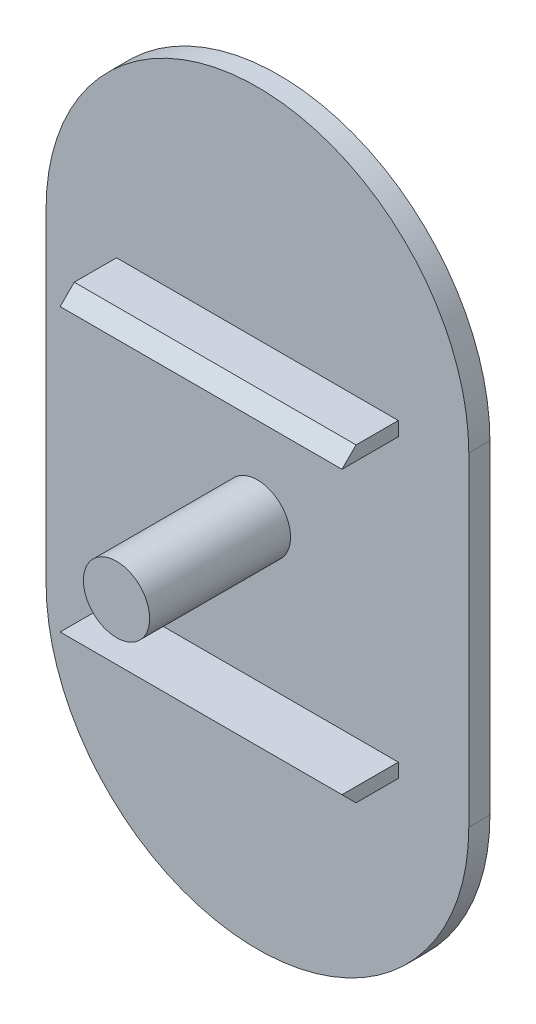
ISO-10303-21;
HEADER;
FILE_DESCRIPTION(('STEP AP214'),'2;1');
FILE_NAME('part.step','',(''),(''),'','','');
FILE_SCHEMA(('AUTOMOTIVE_DESIGN { 1 0 10303 214 1 1 1 1 }'));
ENDSEC;
DATA;
#1=APPLICATION_CONTEXT('core data for automotive mechanical design processes');
#2=APPLICATION_PROTOCOL_DEFINITION('international standard','automotive_design',2000,#1);
#3=PRODUCT_CONTEXT('',#1,'mechanical');
#4=PRODUCT('Part','Part','',(#3));
#5=PRODUCT_RELATED_PRODUCT_CATEGORY('part','',(#4));
#6=PRODUCT_DEFINITION_FORMATION('','',#4);
#7=PRODUCT_DEFINITION_CONTEXT('part definition',#1,'design');
#8=PRODUCT_DEFINITION('design','',#6,#7);
#9=PRODUCT_DEFINITION_SHAPE('','',#8);
#10=(LENGTH_UNIT() NAMED_UNIT(*) SI_UNIT(.MILLI.,.METRE.));
#11=(NAMED_UNIT(*) PLANE_ANGLE_UNIT() SI_UNIT($,.RADIAN.));
#12=(NAMED_UNIT(*) SI_UNIT($,.STERADIAN.) SOLID_ANGLE_UNIT());
#13=UNCERTAINTY_MEASURE_WITH_UNIT(LENGTH_MEASURE(1.E-05),#10,'distance_accuracy_value','');
#14=(GEOMETRIC_REPRESENTATION_CONTEXT(3) GLOBAL_UNCERTAINTY_ASSIGNED_CONTEXT((#13)) GLOBAL_UNIT_ASSIGNED_CONTEXT((#10,
#11,#12)) REPRESENTATION_CONTEXT('',''));
#15=CARTESIAN_POINT('',(0.,0.,0.));
#16=DIRECTION('',(0.,0.,1.));
#17=DIRECTION('',(1.,0.,0.));
#18=AXIS2_PLACEMENT_3D('',#15,#16,#17);
#19=CARTESIAN_POINT('',(0.,11.5,1.5));
#20=DIRECTION('',(0.,0.,-1.));
#21=DIRECTION('',(-1.,0.,0.));
#22=AXIS2_PLACEMENT_3D('',#19,#20,#21);
#23=PLANE('',#22);
#24=DIRECTION('',(0.,1.,0.));
#25=VECTOR('',#24,1.);
#26=CARTESIAN_POINT('',(10.,-11.,1.5));
#27=LINE('',#26,#25);
#28=CARTESIAN_POINT('',(10.,-11.,1.5));
#29=VERTEX_POINT('',#28);
#30=CARTESIAN_POINT('',(10.,-10.,1.5));
#31=VERTEX_POINT('',#30);
#32=EDGE_CURVE('E148',#29,#31,#27,.T.);
#33=ORIENTED_EDGE('',*,*,#32,.F.);
#34=DIRECTION('',(1.,0.,0.));
#35=VECTOR('',#34,1.);
#36=CARTESIAN_POINT('',(-10.,-11.,1.5));
#37=LINE('',#36,#35);
#38=CARTESIAN_POINT('',(-10.,-11.,1.5));
#39=VERTEX_POINT('',#38);
#40=EDGE_CURVE('E178',#39,#29,#37,.T.);
#41=ORIENTED_EDGE('',*,*,#40,.F.);
#42=DIRECTION('',(0.,-1.,0.));
#43=VECTOR('',#42,1.);
#44=CARTESIAN_POINT('',(-10.,-10.,1.5));
#45=LINE('',#44,#43);
#46=CARTESIAN_POINT('',(-10.,-10.,1.5));
#47=VERTEX_POINT('',#46);
#48=EDGE_CURVE('E186',#47,#39,#45,.T.);
#49=ORIENTED_EDGE('',*,*,#48,.F.);
#50=DIRECTION('',(-1.,0.,0.));
#51=VECTOR('',#50,1.);
#52=CARTESIAN_POINT('',(-10.,-10.,1.5));
#53=LINE('',#52,#51);
#54=EDGE_CURVE('E182',#31,#47,#53,.T.);
#55=ORIENTED_EDGE('',*,*,#54,.F.);
#56=EDGE_LOOP('',(#33,#41,#49,#55));
#57=FACE_BOUND('',#56,.T.);
#58=CARTESIAN_POINT('',(0.,0.,1.5));
#59=DIRECTION('',(0.,0.,-1.));
#60=DIRECTION('',(-1.,0.,0.));
#61=AXIS2_PLACEMENT_3D('',#58,#59,#60);
#62=CIRCLE('',#61,2.35);
#63=CARTESIAN_POINT('',(-2.35,0.,1.5));
#64=VERTEX_POINT('',#63);
#65=EDGE_CURVE('E284',#64,#64,#62,.F.);
#66=ORIENTED_EDGE('',*,*,#65,.F.);
#67=EDGE_LOOP('',(#66));
#68=FACE_BOUND('',#67,.T.);
#69=CARTESIAN_POINT('',(0.,11.5,1.5));
#70=DIRECTION('',(0.,0.,1.));
#71=DIRECTION('',(-1.,0.,0.));
#72=AXIS2_PLACEMENT_3D('',#69,#70,#71);
#73=CIRCLE('',#72,15.);
#74=CARTESIAN_POINT('',(15.,11.5,1.5));
#75=VERTEX_POINT('',#74);
#76=CARTESIAN_POINT('',(-15.,11.5,1.5));
#77=VERTEX_POINT('',#76);
#78=EDGE_CURVE('E235',#75,#77,#73,.T.);
#79=ORIENTED_EDGE('',*,*,#78,.T.);
#80=DIRECTION('',(0.,-1.,0.));
#81=VECTOR('',#80,1.);
#82=CARTESIAN_POINT('',(-15.,-11.5,1.5));
#83=LINE('',#82,#81);
#84=CARTESIAN_POINT('',(-15.,-11.5,1.5));
#85=VERTEX_POINT('',#84);
#86=EDGE_CURVE('E239',#77,#85,#83,.T.);
#87=ORIENTED_EDGE('',*,*,#86,.T.);
#88=CARTESIAN_POINT('',(0.,-11.5,1.5));
#89=DIRECTION('',(0.,0.,1.));
#90=DIRECTION('',(1.,0.,0.));
#91=AXIS2_PLACEMENT_3D('',#88,#89,#90);
#92=CIRCLE('',#91,15.);
#93=CARTESIAN_POINT('',(15.,-11.5,1.5));
#94=VERTEX_POINT('',#93);
#95=EDGE_CURVE('E243',#85,#94,#92,.T.);
#96=ORIENTED_EDGE('',*,*,#95,.T.);
#97=DIRECTION('',(0.,1.,0.));
#98=VECTOR('',#97,1.);
#99=CARTESIAN_POINT('',(15.,11.5,1.5));
#100=LINE('',#99,#98);
#101=EDGE_CURVE('E246',#94,#75,#100,.T.);
#102=ORIENTED_EDGE('',*,*,#101,.T.);
#103=EDGE_LOOP('',(#79,#87,#96,#102));
#104=FACE_BOUND('',#103,.T.);
#105=DIRECTION('',(1.,0.,0.));
#106=VECTOR('',#105,1.);
#107=CARTESIAN_POINT('',(-10.,10.,1.5));
#108=LINE('',#107,#106);
#109=CARTESIAN_POINT('',(-10.,10.,1.5));
#110=VERTEX_POINT('',#109);
#111=CARTESIAN_POINT('',(10.,10.,1.5));
#112=VERTEX_POINT('',#111);
#113=EDGE_CURVE('E136',#110,#112,#108,.T.);
#114=ORIENTED_EDGE('',*,*,#113,.F.);
#115=DIRECTION('',(0.,-1.,0.));
#116=VECTOR('',#115,1.);
#117=CARTESIAN_POINT('',(-10.,10.,1.5));
#118=LINE('',#117,#116);
#119=CARTESIAN_POINT('',(-10.,11.,1.5));
#120=VERTEX_POINT('',#119);
#121=EDGE_CURVE('E139',#120,#110,#118,.T.);
#122=ORIENTED_EDGE('',*,*,#121,.F.);
#123=DIRECTION('',(-1.,0.,0.));
#124=VECTOR('',#123,1.);
#125=CARTESIAN_POINT('',(-10.,11.,1.5));
#126=LINE('',#125,#124);
#127=CARTESIAN_POINT('',(10.,11.,1.5));
#128=VERTEX_POINT('',#127);
#129=EDGE_CURVE('E155',#128,#120,#126,.T.);
#130=ORIENTED_EDGE('',*,*,#129,.F.);
#131=DIRECTION('',(0.,1.,0.));
#132=VECTOR('',#131,1.);
#133=CARTESIAN_POINT('',(10.,11.,1.5));
#134=LINE('',#133,#132);
#135=EDGE_CURVE('E142',#112,#128,#134,.T.);
#136=ORIENTED_EDGE('',*,*,#135,.F.);
#137=EDGE_LOOP('',(#114,#122,#130,#136));
#138=FACE_BOUND('',#137,.T.);
#139=ADVANCED_FACE('F47',(#57,#68,#104,#138),#23,.F.);
#140=CARTESIAN_POINT('',(0.,11.5,1.5));
#141=DIRECTION('',(0.,0.,-1.));
#142=DIRECTION('',(-1.,0.,0.));
#143=AXIS2_PLACEMENT_3D('',#140,#141,#142);
#144=CYLINDRICAL_SURFACE('',#143,15.);
#145=CARTESIAN_POINT('',(0.,11.5,0.));
#146=DIRECTION('',(0.,0.,1.));
#147=DIRECTION('',(-1.,0.,0.));
#148=AXIS2_PLACEMENT_3D('',#145,#146,#147);
#149=CIRCLE('',#148,15.);
#150=CARTESIAN_POINT('',(15.,11.5,0.));
#151=VERTEX_POINT('',#150);
#152=CARTESIAN_POINT('',(-15.,11.5,0.));
#153=VERTEX_POINT('',#152);
#154=EDGE_CURVE('E231',#151,#153,#149,.T.);
#155=ORIENTED_EDGE('',*,*,#154,.T.);
#156=DIRECTION('',(0.,0.,-1.));
#157=VECTOR('',#156,1.);
#158=CARTESIAN_POINT('',(-15.,11.5,1.5));
#159=LINE('',#158,#157);
#160=EDGE_CURVE('E272',#77,#153,#159,.T.);
#161=ORIENTED_EDGE('',*,*,#160,.F.);
#162=ORIENTED_EDGE('',*,*,#78,.F.);
#163=DIRECTION('',(0.,0.,-1.));
#164=VECTOR('',#163,1.);
#165=CARTESIAN_POINT('',(15.,11.5,1.5));
#166=LINE('',#165,#164);
#167=EDGE_CURVE('E249',#75,#151,#166,.T.);
#168=ORIENTED_EDGE('',*,*,#167,.T.);
#169=EDGE_LOOP('',(#155,#161,#162,#168));
#170=FACE_BOUND('',#169,.T.);
#171=ADVANCED_FACE('F321',(#170),#144,.T.);
#172=CARTESIAN_POINT('',(-15.,-11.5,1.5));
#173=DIRECTION('',(1.,0.,0.));
#174=DIRECTION('',(0.,0.,-1.));
#175=AXIS2_PLACEMENT_3D('',#172,#173,#174);
#176=PLANE('',#175);
#177=DIRECTION('',(0.,-1.,0.));
#178=VECTOR('',#177,1.);
#179=CARTESIAN_POINT('',(-15.,-11.5,0.));
#180=LINE('',#179,#178);
#181=CARTESIAN_POINT('',(-15.,-11.5,0.));
#182=VERTEX_POINT('',#181);
#183=EDGE_CURVE('E253',#153,#182,#180,.T.);
#184=ORIENTED_EDGE('',*,*,#183,.T.);
#185=DIRECTION('',(0.,0.,-1.));
#186=VECTOR('',#185,1.);
#187=CARTESIAN_POINT('',(-15.,-11.5,1.5));
#188=LINE('',#187,#186);
#189=EDGE_CURVE('E268',#85,#182,#188,.T.);
#190=ORIENTED_EDGE('',*,*,#189,.F.);
#191=ORIENTED_EDGE('',*,*,#86,.F.);
#192=ORIENTED_EDGE('',*,*,#160,.T.);
#193=EDGE_LOOP('',(#184,#190,#191,#192));
#194=FACE_BOUND('',#193,.T.);
#195=ADVANCED_FACE('F333',(#194),#176,.F.);
#196=CARTESIAN_POINT('',(0.,-11.5,1.5));
#197=DIRECTION('',(0.,0.,-1.));
#198=DIRECTION('',(-1.,0.,0.));
#199=AXIS2_PLACEMENT_3D('',#196,#197,#198);
#200=CYLINDRICAL_SURFACE('',#199,15.);
#201=CARTESIAN_POINT('',(0.,-11.5,0.));
#202=DIRECTION('',(0.,0.,1.));
#203=DIRECTION('',(1.,0.,0.));
#204=AXIS2_PLACEMENT_3D('',#201,#202,#203);
#205=CIRCLE('',#204,15.);
#206=CARTESIAN_POINT('',(15.,-11.5,0.));
#207=VERTEX_POINT('',#206);
#208=EDGE_CURVE('E256',#182,#207,#205,.T.);
#209=ORIENTED_EDGE('',*,*,#208,.T.);
#210=DIRECTION('',(0.,0.,-1.));
#211=VECTOR('',#210,1.);
#212=CARTESIAN_POINT('',(15.,-11.5,1.5));
#213=LINE('',#212,#211);
#214=EDGE_CURVE('E264',#94,#207,#213,.T.);
#215=ORIENTED_EDGE('',*,*,#214,.F.);
#216=ORIENTED_EDGE('',*,*,#95,.F.);
#217=ORIENTED_EDGE('',*,*,#189,.T.);
#218=EDGE_LOOP('',(#209,#215,#216,#217));
#219=FACE_BOUND('',#218,.T.);
#220=ADVANCED_FACE('F338',(#219),#200,.T.);
#221=CARTESIAN_POINT('',(15.,11.5,1.5));
#222=DIRECTION('',(-1.,0.,0.));
#223=DIRECTION('',(0.,0.,1.));
#224=AXIS2_PLACEMENT_3D('',#221,#222,#223);
#225=PLANE('',#224);
#226=DIRECTION('',(0.,1.,0.));
#227=VECTOR('',#226,1.);
#228=CARTESIAN_POINT('',(15.,11.5,0.));
#229=LINE('',#228,#227);
#230=EDGE_CURVE('E240',#207,#151,#229,.T.);
#231=ORIENTED_EDGE('',*,*,#230,.T.);
#232=ORIENTED_EDGE('',*,*,#167,.F.);
#233=ORIENTED_EDGE('',*,*,#101,.F.);
#234=ORIENTED_EDGE('',*,*,#214,.T.);
#235=EDGE_LOOP('',(#231,#232,#233,#234));
#236=FACE_BOUND('',#235,.T.);
#237=ADVANCED_FACE('F341',(#236),#225,.F.);
#238=CARTESIAN_POINT('',(0.,11.5,0.));
#239=DIRECTION('',(0.,0.,-1.));
#240=DIRECTION('',(-1.,0.,0.));
#241=AXIS2_PLACEMENT_3D('',#238,#239,#240);
#242=PLANE('',#241);
#243=CARTESIAN_POINT('',(-3.47592832449396E-13,-12.5,0.));
#244=DIRECTION('',(0.,0.,-1.));
#245=DIRECTION('',(-1.,0.,0.));
#246=AXIS2_PLACEMENT_3D('',#243,#244,#245);
#247=CIRCLE('',#246,1.85);
#248=CARTESIAN_POINT('',(-1.85000000000035,-12.5,0.));
#249=VERTEX_POINT('',#248);
#250=EDGE_CURVE('E219',#249,#249,#247,.T.);
#251=ORIENTED_EDGE('',*,*,#250,.F.);
#252=EDGE_LOOP('',(#251));
#253=FACE_BOUND('',#252,.T.);
#254=CARTESIAN_POINT('',(0.,12.5,0.));
#255=DIRECTION('',(0.,0.,-1.));
#256=DIRECTION('',(-1.,0.,0.));
#257=AXIS2_PLACEMENT_3D('',#254,#255,#256);
#258=CIRCLE('',#257,1.85);
#259=CARTESIAN_POINT('',(-1.85,12.5,0.));
#260=VERTEX_POINT('',#259);
#261=EDGE_CURVE('E223',#260,#260,#258,.T.);
#262=ORIENTED_EDGE('',*,*,#261,.F.);
#263=EDGE_LOOP('',(#262));
#264=FACE_BOUND('',#263,.T.);
#265=ORIENTED_EDGE('',*,*,#154,.F.);
#266=ORIENTED_EDGE('',*,*,#230,.F.);
#267=ORIENTED_EDGE('',*,*,#208,.F.);
#268=ORIENTED_EDGE('',*,*,#183,.F.);
#269=EDGE_LOOP('',(#265,#266,#267,#268));
#270=FACE_BOUND('',#269,.T.);
#271=ADVANCED_FACE('F343',(#253,#264,#270),#242,.T.);
#272=CARTESIAN_POINT('',(0.,12.5,-1.5));
#273=DIRECTION('',(0.,0.,1.));
#274=DIRECTION('',(1.,0.,0.));
#275=AXIS2_PLACEMENT_3D('',#272,#273,#274);
#276=CYLINDRICAL_SURFACE('',#275,1.85);
#277=CARTESIAN_POINT('',(0.,12.5,-1.5));
#278=DIRECTION('',(0.,0.,-1.));
#279=DIRECTION('',(-1.,0.,0.));
#280=AXIS2_PLACEMENT_3D('',#277,#278,#279);
#281=CIRCLE('',#280,1.85);
#282=CARTESIAN_POINT('',(-1.85,12.5,-1.5));
#283=VERTEX_POINT('',#282);
#284=EDGE_CURVE('E227',#283,#283,#281,.T.);
#285=ORIENTED_EDGE('',*,*,#284,.F.);
#286=EDGE_LOOP('',(#285));
#287=FACE_BOUND('',#286,.T.);
#288=ORIENTED_EDGE('',*,*,#261,.T.);
#289=EDGE_LOOP('',(#288));
#290=FACE_BOUND('',#289,.T.);
#291=ADVANCED_FACE('F345',(#287,#290),#276,.T.);
#292=CARTESIAN_POINT('',(-3.47592832449396E-13,-12.5,-1.5));
#293=DIRECTION('',(0.,0.,1.));
#294=DIRECTION('',(1.,0.,0.));
#295=AXIS2_PLACEMENT_3D('',#292,#293,#294);
#296=CYLINDRICAL_SURFACE('',#295,1.85);
#297=CARTESIAN_POINT('',(-3.47592832449396E-13,-12.5,-1.5));
#298=DIRECTION('',(0.,0.,-1.));
#299=DIRECTION('',(-1.,0.,0.));
#300=AXIS2_PLACEMENT_3D('',#297,#298,#299);
#301=CIRCLE('',#300,1.85);
#302=CARTESIAN_POINT('',(-1.85000000000035,-12.5,-1.5));
#303=VERTEX_POINT('',#302);
#304=EDGE_CURVE('E218',#303,#303,#301,.T.);
#305=ORIENTED_EDGE('',*,*,#304,.F.);
#306=EDGE_LOOP('',(#305));
#307=FACE_BOUND('',#306,.T.);
#308=ORIENTED_EDGE('',*,*,#250,.T.);
#309=EDGE_LOOP('',(#308));
#310=FACE_BOUND('',#309,.T.);
#311=ADVANCED_FACE('F352',(#307,#310),#296,.T.);
#312=CARTESIAN_POINT('',(0.,12.5,-3.2));
#313=DIRECTION('',(0.,0.,-1.));
#314=DIRECTION('',(-1.,0.,0.));
#315=AXIS2_PLACEMENT_3D('',#312,#313,#314);
#316=PLANE('',#315);
#317=CARTESIAN_POINT('',(0.,12.5,-3.2));
#318=DIRECTION('',(0.,0.,-1.));
#319=DIRECTION('',(-1.,0.,0.));
#320=AXIS2_PLACEMENT_3D('',#317,#318,#319);
#321=CIRCLE('',#320,1.87262800667148);
#322=CARTESIAN_POINT('',(-1.87262800667148,12.5,-3.2));
#323=VERTEX_POINT('',#322);
#324=EDGE_CURVE('E280',#323,#323,#321,.T.);
#325=ORIENTED_EDGE('',*,*,#324,.T.);
#326=EDGE_LOOP('',(#325));
#327=FACE_BOUND('',#326,.T.);
#328=ADVANCED_FACE('F415',(#327),#316,.T.);
#329=CARTESIAN_POINT('',(0.,12.5,-1.5));
#330=DIRECTION('',(0.,0.,-1.));
#331=DIRECTION('',(-1.,0.,0.));
#332=AXIS2_PLACEMENT_3D('',#329,#330,#331);
#333=PLANE('',#332);
#334=ORIENTED_EDGE('',*,*,#284,.T.);
#335=EDGE_LOOP('',(#334));
#336=FACE_BOUND('',#335,.T.);
#337=CARTESIAN_POINT('',(0.,12.5,-1.5));
#338=DIRECTION('',(0.,0.,-1.));
#339=DIRECTION('',(-1.,0.,0.));
#340=AXIS2_PLACEMENT_3D('',#337,#338,#339);
#341=CIRCLE('',#340,3.85);
#342=CARTESIAN_POINT('',(-3.85,12.5,-1.5));
#343=VERTEX_POINT('',#342);
#344=EDGE_CURVE('E214',#343,#343,#341,.T.);
#345=ORIENTED_EDGE('',*,*,#344,.F.);
#346=EDGE_LOOP('',(#345));
#347=FACE_BOUND('',#346,.T.);
#348=ADVANCED_FACE('F413',(#336,#347),#333,.F.);
#349=CARTESIAN_POINT('',(-3.47592832449396E-13,-12.5,-3.2));
#350=DIRECTION('',(0.,0.,-1.));
#351=DIRECTION('',(-1.,0.,0.));
#352=AXIS2_PLACEMENT_3D('',#349,#350,#351);
#353=PLANE('',#352);
#354=CARTESIAN_POINT('',(-3.47592832449396E-13,-12.5,-3.2));
#355=DIRECTION('',(0.,0.,-1.));
#356=DIRECTION('',(-1.,0.,0.));
#357=AXIS2_PLACEMENT_3D('',#354,#355,#356);
#358=CIRCLE('',#357,1.87262800667148);
#359=CARTESIAN_POINT('',(-1.87262800667183,-12.5,-3.2));
#360=VERTEX_POINT('',#359);
#361=EDGE_CURVE('E276',#360,#360,#358,.T.);
#362=ORIENTED_EDGE('',*,*,#361,.T.);
#363=EDGE_LOOP('',(#362));
#364=FACE_BOUND('',#363,.T.);
#365=ADVANCED_FACE('F409',(#364),#353,.T.);
#366=CARTESIAN_POINT('',(-3.47592832449396E-13,-12.5,-1.5));
#367=DIRECTION('',(0.,0.,-1.));
#368=DIRECTION('',(-1.,0.,0.));
#369=AXIS2_PLACEMENT_3D('',#366,#367,#368);
#370=PLANE('',#369);
#371=ORIENTED_EDGE('',*,*,#304,.T.);
#372=EDGE_LOOP('',(#371));
#373=FACE_BOUND('',#372,.T.);
#374=CARTESIAN_POINT('',(-3.47592832449396E-13,-12.5,-1.5));
#375=DIRECTION('',(0.,0.,-1.));
#376=DIRECTION('',(-1.,0.,0.));
#377=AXIS2_PLACEMENT_3D('',#374,#375,#376);
#378=CIRCLE('',#377,3.85);
#379=CARTESIAN_POINT('',(-3.85000000000035,-12.5,-1.5));
#380=VERTEX_POINT('',#379);
#381=EDGE_CURVE('E210',#380,#380,#378,.T.);
#382=ORIENTED_EDGE('',*,*,#381,.F.);
#383=EDGE_LOOP('',(#382));
#384=FACE_BOUND('',#383,.T.);
#385=ADVANCED_FACE('F369',(#373,#384),#370,.F.);
#386=CARTESIAN_POINT('',(-3.47592832449396E-13,-12.5,-1.2));
#387=DIRECTION('',(0.,0.,1.));
#388=DIRECTION('',(1.,0.,0.));
#389=AXIS2_PLACEMENT_3D('',#386,#387,#388);
#390=DEGENERATE_TOROIDAL_SURFACE('',#389,1.87262800667148,2.,.T.);
#391=ORIENTED_EDGE('',*,*,#381,.T.);
#392=EDGE_LOOP('',(#391));
#393=FACE_BOUND('',#392,.T.);
#394=ORIENTED_EDGE('',*,*,#361,.F.);
#395=EDGE_LOOP('',(#394));
#396=FACE_BOUND('',#395,.T.);
#397=ADVANCED_FACE('F365',(#393,#396),#390,.T.);
#398=CARTESIAN_POINT('',(0.,12.5,-1.2));
#399=DIRECTION('',(0.,0.,1.));
#400=DIRECTION('',(1.,0.,0.));
#401=AXIS2_PLACEMENT_3D('',#398,#399,#400);
#402=DEGENERATE_TOROIDAL_SURFACE('',#401,1.87262800667148,2.,.T.);
#403=ORIENTED_EDGE('',*,*,#344,.T.);
#404=EDGE_LOOP('',(#403));
#405=FACE_BOUND('',#404,.T.);
#406=ORIENTED_EDGE('',*,*,#324,.F.);
#407=EDGE_LOOP('',(#406));
#408=FACE_BOUND('',#407,.T.);
#409=ADVANCED_FACE('F368',(#405,#408),#402,.T.);
#410=CARTESIAN_POINT('',(0.,0.,11.5));
#411=DIRECTION('',(0.,0.,-1.));
#412=DIRECTION('',(-1.,0.,0.));
#413=AXIS2_PLACEMENT_3D('',#410,#411,#412);
#414=CYLINDRICAL_SURFACE('',#413,2.35);
#415=CARTESIAN_POINT('',(0.,0.,11.5));
#416=DIRECTION('',(0.,0.,1.));
#417=DIRECTION('',(1.,0.,0.));
#418=AXIS2_PLACEMENT_3D('',#415,#416,#417);
#419=CIRCLE('',#418,2.35);
#420=CARTESIAN_POINT('',(2.35,0.,11.5));
#421=VERTEX_POINT('',#420);
#422=EDGE_CURVE('E206',#421,#421,#419,.T.);
#423=ORIENTED_EDGE('',*,*,#422,.F.);
#424=EDGE_LOOP('',(#423));
#425=FACE_BOUND('',#424,.T.);
#426=ORIENTED_EDGE('',*,*,#65,.T.);
#427=EDGE_LOOP('',(#426));
#428=FACE_BOUND('',#427,.T.);
#429=ADVANCED_FACE('F372',(#425,#428),#414,.T.);
#430=CARTESIAN_POINT('',(0.,0.,11.5));
#431=DIRECTION('',(0.,0.,1.));
#432=DIRECTION('',(1.,0.,0.));
#433=AXIS2_PLACEMENT_3D('',#430,#431,#432);
#434=PLANE('',#433);
#435=ORIENTED_EDGE('',*,*,#422,.T.);
#436=EDGE_LOOP('',(#435));
#437=FACE_BOUND('',#436,.T.);
#438=ADVANCED_FACE('F400',(#437),#434,.T.);
#439=CARTESIAN_POINT('',(10.,-11.,5.5));
#440=DIRECTION('',(-1.,0.,0.));
#441=DIRECTION('',(0.,0.,1.));
#442=AXIS2_PLACEMENT_3D('',#439,#440,#441);
#443=PLANE('',#442);
#444=DIRECTION('',(0.,0.,-1.));
#445=VECTOR('',#444,1.);
#446=CARTESIAN_POINT('',(10.,-10.,5.5));
#447=LINE('',#446,#445);
#448=CARTESIAN_POINT('',(10.,-10.,5.5));
#449=VERTEX_POINT('',#448);
#450=EDGE_CURVE('E202',#449,#31,#447,.T.);
#451=ORIENTED_EDGE('',*,*,#450,.F.);
#452=DIRECTION('',(0.,0.707106781186545,0.70710678118655));
#453=VECTOR('',#452,1.);
#454=CARTESIAN_POINT('',(10.,-10.,5.5));
#455=LINE('',#454,#453);
#456=CARTESIAN_POINT('',(10.,-11.,4.49999999999999));
#457=VERTEX_POINT('',#456);
#458=EDGE_CURVE('E288',#449,#457,#455,.F.);
#459=ORIENTED_EDGE('',*,*,#458,.T.);
#460=DIRECTION('',(0.,0.,-1.));
#461=VECTOR('',#460,1.);
#462=CARTESIAN_POINT('',(10.,-11.,5.5));
#463=LINE('',#462,#461);
#464=EDGE_CURVE('E177',#457,#29,#463,.T.);
#465=ORIENTED_EDGE('',*,*,#464,.T.);
#466=ORIENTED_EDGE('',*,*,#32,.T.);
#467=EDGE_LOOP('',(#451,#459,#465,#466));
#468=FACE_BOUND('',#467,.T.);
#469=ADVANCED_FACE('F313',(#468),#443,.F.);
#470=CARTESIAN_POINT('',(-10.,-10.,5.5));
#471=DIRECTION('',(0.,-1.,0.));
#472=DIRECTION('',(0.,0.,-1.));
#473=AXIS2_PLACEMENT_3D('',#470,#471,#472);
#474=PLANE('',#473);
#475=ORIENTED_EDGE('',*,*,#54,.T.);
#476=DIRECTION('',(0.,0.,-1.));
#477=VECTOR('',#476,1.);
#478=CARTESIAN_POINT('',(-10.,-10.,5.5));
#479=LINE('',#478,#477);
#480=CARTESIAN_POINT('',(-10.,-10.,5.5));
#481=VERTEX_POINT('',#480);
#482=EDGE_CURVE('E198',#481,#47,#479,.T.);
#483=ORIENTED_EDGE('',*,*,#482,.F.);
#484=DIRECTION('',(-1.,0.,0.));
#485=VECTOR('',#484,1.);
#486=CARTESIAN_POINT('',(-10.,-10.,5.5));
#487=LINE('',#486,#485);
#488=EDGE_CURVE('E173',#449,#481,#487,.T.);
#489=ORIENTED_EDGE('',*,*,#488,.F.);
#490=ORIENTED_EDGE('',*,*,#450,.T.);
#491=EDGE_LOOP('',(#475,#483,#489,#490));
#492=FACE_BOUND('',#491,.T.);
#493=ADVANCED_FACE('F308',(#492),#474,.F.);
#494=CARTESIAN_POINT('',(-10.,-10.,5.5));
#495=DIRECTION('',(1.,0.,0.));
#496=DIRECTION('',(0.,0.,-1.));
#497=AXIS2_PLACEMENT_3D('',#494,#495,#496);
#498=PLANE('',#497);
#499=DIRECTION('',(0.,0.,-1.));
#500=VECTOR('',#499,1.);
#501=CARTESIAN_POINT('',(-10.,-11.,5.5));
#502=LINE('',#501,#500);
#503=CARTESIAN_POINT('',(-10.,-11.,4.49999999999999));
#504=VERTEX_POINT('',#503);
#505=EDGE_CURVE('E195',#504,#39,#502,.T.);
#506=ORIENTED_EDGE('',*,*,#505,.F.);
#507=DIRECTION('',(0.,-0.707106781186545,-0.70710678118655));
#508=VECTOR('',#507,1.);
#509=CARTESIAN_POINT('',(-10.,-10.,5.5));
#510=LINE('',#509,#508);
#511=EDGE_CURVE('E294',#504,#481,#510,.F.);
#512=ORIENTED_EDGE('',*,*,#511,.T.);
#513=ORIENTED_EDGE('',*,*,#482,.T.);
#514=ORIENTED_EDGE('',*,*,#48,.T.);
#515=EDGE_LOOP('',(#506,#512,#513,#514));
#516=FACE_BOUND('',#515,.T.);
#517=ADVANCED_FACE('F303',(#516),#498,.F.);
#518=CARTESIAN_POINT('',(-10.,-11.,5.5));
#519=DIRECTION('',(0.,1.,0.));
#520=DIRECTION('',(0.,0.,1.));
#521=AXIS2_PLACEMENT_3D('',#518,#519,#520);
#522=PLANE('',#521);
#523=ORIENTED_EDGE('',*,*,#464,.F.);
#524=DIRECTION('',(-1.,0.,0.));
#525=VECTOR('',#524,1.);
#526=CARTESIAN_POINT('',(-10.,-11.,4.49999999999999));
#527=LINE('',#526,#525);
#528=EDGE_CURVE('E291',#457,#504,#527,.T.);
#529=ORIENTED_EDGE('',*,*,#528,.T.);
#530=ORIENTED_EDGE('',*,*,#505,.T.);
#531=ORIENTED_EDGE('',*,*,#40,.T.);
#532=EDGE_LOOP('',(#523,#529,#530,#531));
#533=FACE_BOUND('',#532,.T.);
#534=ADVANCED_FACE('F316',(#533),#522,.F.);
#535=CARTESIAN_POINT('',(-10.,10.,5.5));
#536=DIRECTION('',(0.,1.,0.));
#537=DIRECTION('',(0.,0.,1.));
#538=AXIS2_PLACEMENT_3D('',#535,#536,#537);
#539=PLANE('',#538);
#540=ORIENTED_EDGE('',*,*,#113,.T.);
#541=DIRECTION('',(0.,0.,-1.));
#542=VECTOR('',#541,1.);
#543=CARTESIAN_POINT('',(10.,10.,5.5));
#544=LINE('',#543,#542);
#545=CARTESIAN_POINT('',(10.,10.,5.5));
#546=VERTEX_POINT('',#545);
#547=EDGE_CURVE('E586',#546,#112,#544,.T.);
#548=ORIENTED_EDGE('',*,*,#547,.F.);
#549=DIRECTION('',(1.,0.,0.));
#550=VECTOR('',#549,1.);
#551=CARTESIAN_POINT('',(-10.,10.,5.5));
#552=LINE('',#551,#550);
#553=CARTESIAN_POINT('',(-10.,10.,5.5));
#554=VERTEX_POINT('',#553);
#555=EDGE_CURVE('E156',#554,#546,#552,.T.);
#556=ORIENTED_EDGE('',*,*,#555,.F.);
#557=DIRECTION('',(0.,0.,-1.));
#558=VECTOR('',#557,1.);
#559=CARTESIAN_POINT('',(-10.,10.,5.5));
#560=LINE('',#559,#558);
#561=EDGE_CURVE('E151',#554,#110,#560,.T.);
#562=ORIENTED_EDGE('',*,*,#561,.T.);
#563=EDGE_LOOP('',(#540,#548,#556,#562));
#564=FACE_BOUND('',#563,.T.);
#565=ADVANCED_FACE('F158',(#564),#539,.F.);
#566=CARTESIAN_POINT('',(10.,11.,5.5));
#567=DIRECTION('',(-1.,0.,0.));
#568=DIRECTION('',(0.,-1.,0.));
#569=AXIS2_PLACEMENT_3D('',#566,#567,#568);
#570=PLANE('',#569);
#571=DIRECTION('',(0.,0.,-1.));
#572=VECTOR('',#571,1.);
#573=CARTESIAN_POINT('',(10.,11.,5.5));
#574=LINE('',#573,#572);
#575=CARTESIAN_POINT('',(10.,11.,4.49999999999999));
#576=VERTEX_POINT('',#575);
#577=EDGE_CURVE('E165',#576,#128,#574,.T.);
#578=ORIENTED_EDGE('',*,*,#577,.F.);
#579=DIRECTION('',(0.,0.707106781186545,-0.70710678118655));
#580=VECTOR('',#579,1.);
#581=CARTESIAN_POINT('',(10.,10.,5.49999999999999));
#582=LINE('',#581,#580);
#583=EDGE_CURVE('E11',#576,#546,#582,.F.);
#584=ORIENTED_EDGE('',*,*,#583,.T.);
#585=ORIENTED_EDGE('',*,*,#547,.T.);
#586=ORIENTED_EDGE('',*,*,#135,.T.);
#587=EDGE_LOOP('',(#578,#584,#585,#586));
#588=FACE_BOUND('',#587,.T.);
#589=ADVANCED_FACE('F388',(#588),#570,.F.);
#590=CARTESIAN_POINT('',(-10.,11.,5.5));
#591=DIRECTION('',(0.,-1.,0.));
#592=DIRECTION('',(0.,0.,-1.));
#593=AXIS2_PLACEMENT_3D('',#590,#591,#592);
#594=PLANE('',#593);
#595=DIRECTION('',(0.,0.,-1.));
#596=VECTOR('',#595,1.);
#597=CARTESIAN_POINT('',(-10.,11.,5.5));
#598=LINE('',#597,#596);
#599=CARTESIAN_POINT('',(-10.,11.,4.49999999999999));
#600=VERTEX_POINT('',#599);
#601=EDGE_CURVE('E153',#600,#120,#598,.T.);
#602=ORIENTED_EDGE('',*,*,#601,.F.);
#603=DIRECTION('',(1.,0.,0.));
#604=VECTOR('',#603,1.);
#605=CARTESIAN_POINT('',(-10.,11.,4.49999999999999));
#606=LINE('',#605,#604);
#607=EDGE_CURVE('E57',#600,#576,#606,.T.);
#608=ORIENTED_EDGE('',*,*,#607,.T.);
#609=ORIENTED_EDGE('',*,*,#577,.T.);
#610=ORIENTED_EDGE('',*,*,#129,.T.);
#611=EDGE_LOOP('',(#602,#608,#609,#610));
#612=FACE_BOUND('',#611,.T.);
#613=ADVANCED_FACE('F383',(#612),#594,.F.);
#614=CARTESIAN_POINT('',(-10.,10.,5.5));
#615=DIRECTION('',(1.,0.,0.));
#616=DIRECTION('',(0.,1.,0.));
#617=AXIS2_PLACEMENT_3D('',#614,#615,#616);
#618=PLANE('',#617);
#619=ORIENTED_EDGE('',*,*,#561,.F.);
#620=DIRECTION('',(0.,-0.707106781186545,0.70710678118655));
#621=VECTOR('',#620,1.);
#622=CARTESIAN_POINT('',(-10.,9.99999999999998,5.50000000000001));
#623=LINE('',#622,#621);
#624=EDGE_CURVE('E71',#554,#600,#623,.F.);
#625=ORIENTED_EDGE('',*,*,#624,.T.);
#626=ORIENTED_EDGE('',*,*,#601,.T.);
#627=ORIENTED_EDGE('',*,*,#121,.T.);
#628=EDGE_LOOP('',(#619,#625,#626,#627));
#629=FACE_BOUND('',#628,.T.);
#630=ADVANCED_FACE('F150',(#629),#618,.F.);
#631=CARTESIAN_POINT('',(0.,-10.,5.5));
#632=DIRECTION('',(0.,0.70710678118655,-0.707106781186545));
#633=DIRECTION('',(1.,0.,0.));
#634=AXIS2_PLACEMENT_3D('',#631,#632,#633);
#635=PLANE('',#634);
#636=ORIENTED_EDGE('',*,*,#511,.F.);
#637=ORIENTED_EDGE('',*,*,#528,.F.);
#638=ORIENTED_EDGE('',*,*,#458,.F.);
#639=ORIENTED_EDGE('',*,*,#488,.T.);
#640=EDGE_LOOP('',(#636,#637,#638,#639));
#641=FACE_BOUND('',#640,.T.);
#642=ADVANCED_FACE('F310',(#641),#635,.F.);
#643=CARTESIAN_POINT('',(0.,10.,5.5));
#644=DIRECTION('',(0.,-0.70710678118655,-0.707106781186545));
#645=DIRECTION('',(-1.,0.,0.));
#646=AXIS2_PLACEMENT_3D('',#643,#644,#645);
#647=PLANE('',#646);
#648=ORIENTED_EDGE('',*,*,#583,.F.);
#649=ORIENTED_EDGE('',*,*,#607,.F.);
#650=ORIENTED_EDGE('',*,*,#624,.F.);
#651=ORIENTED_EDGE('',*,*,#555,.T.);
#652=EDGE_LOOP('',(#648,#649,#650,#651));
#653=FACE_BOUND('',#652,.T.);
#654=ADVANCED_FACE('F50',(#653),#647,.F.);
#655=CLOSED_SHELL('',(#139,#171,#195,#220,#237,#271,#291,#311,#328,#348,#365,#385,#397,#409,
#429,#438,#469,#493,#517,#534,#565,#589,#613,#630,#642,#654));
#656=MANIFOLD_SOLID_BREP('B2',#655);
#657=ADVANCED_BREP_SHAPE_REPRESENTATION('',(#18,#656),#14);
#658=SHAPE_DEFINITION_REPRESENTATION(#9,#657);
ENDSEC;
END-ISO-10303-21;
